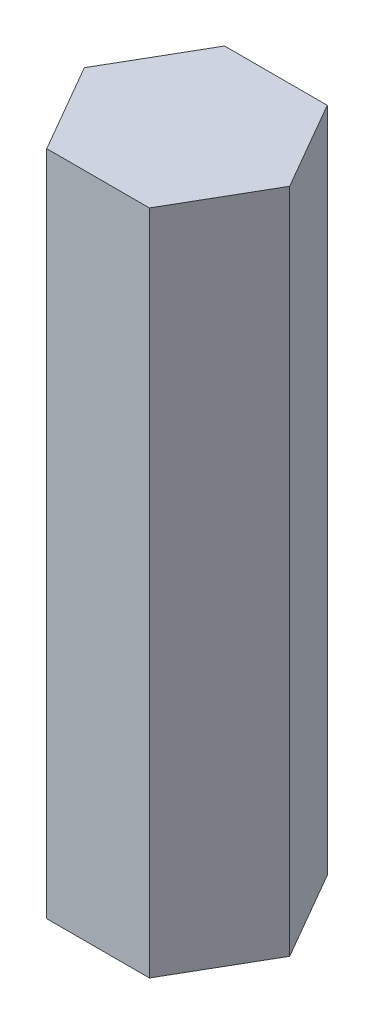
ISO-10303-21;
HEADER;
FILE_DESCRIPTION(('STEP AP214'),'2;1');
FILE_NAME('part.step','',(''),(''),'','','');
FILE_SCHEMA(('AUTOMOTIVE_DESIGN { 1 0 10303 214 1 1 1 1 }'));
ENDSEC;
DATA;
#1=APPLICATION_CONTEXT('core data for automotive mechanical design processes');
#2=APPLICATION_PROTOCOL_DEFINITION('international standard','automotive_design',2000,#1);
#3=PRODUCT_CONTEXT('',#1,'mechanical');
#4=PRODUCT('Part','Part','',(#3));
#5=PRODUCT_RELATED_PRODUCT_CATEGORY('part','',(#4));
#6=PRODUCT_DEFINITION_FORMATION('','',#4);
#7=PRODUCT_DEFINITION_CONTEXT('part definition',#1,'design');
#8=PRODUCT_DEFINITION('design','',#6,#7);
#9=PRODUCT_DEFINITION_SHAPE('','',#8);
#10=(LENGTH_UNIT() NAMED_UNIT(*) SI_UNIT(.MILLI.,.METRE.));
#11=(NAMED_UNIT(*) PLANE_ANGLE_UNIT() SI_UNIT($,.RADIAN.));
#12=(NAMED_UNIT(*) SI_UNIT($,.STERADIAN.) SOLID_ANGLE_UNIT());
#13=UNCERTAINTY_MEASURE_WITH_UNIT(LENGTH_MEASURE(1.E-05),#10,'distance_accuracy_value','');
#14=(GEOMETRIC_REPRESENTATION_CONTEXT(3) GLOBAL_UNCERTAINTY_ASSIGNED_CONTEXT((#13)) GLOBAL_UNIT_ASSIGNED_CONTEXT((#10,
#11,#12)) REPRESENTATION_CONTEXT('',''));
#15=CARTESIAN_POINT('',(0.,0.,0.));
#16=DIRECTION('',(0.,0.,1.));
#17=DIRECTION('',(1.,0.,0.));
#18=AXIS2_PLACEMENT_3D('',#15,#16,#17);
#19=CARTESIAN_POINT('',(2.30940107675852,30.,3.99999999999998));
#20=DIRECTION('',(-0.866025403784439,0.,-0.5));
#21=DIRECTION('',(-0.5,0.,0.866025403784439));
#22=AXIS2_PLACEMENT_3D('',#19,#20,#21);
#23=PLANE('',#22);
#24=DIRECTION('',(0.5,0.,-0.866025403784439));
#25=VECTOR('',#24,1.);
#26=CARTESIAN_POINT('',(2.30940107675852,0.,3.99999999999998));
#27=LINE('',#26,#25);
#28=CARTESIAN_POINT('',(2.30940107675852,0.,3.99999999999998));
#29=VERTEX_POINT('',#28);
#30=CARTESIAN_POINT('',(4.618802153517,0.,0.));
#31=VERTEX_POINT('',#30);
#32=EDGE_CURVE('E116',#29,#31,#27,.T.);
#33=ORIENTED_EDGE('',*,*,#32,.T.);
#34=DIRECTION('',(0.,-1.,0.));
#35=VECTOR('',#34,1.);
#36=CARTESIAN_POINT('',(4.618802153517,30.,0.));
#37=LINE('',#36,#35);
#38=CARTESIAN_POINT('',(4.618802153517,30.,0.));
#39=VERTEX_POINT('',#38);
#40=EDGE_CURVE('E11',#39,#31,#37,.T.);
#41=ORIENTED_EDGE('',*,*,#40,.F.);
#42=DIRECTION('',(0.5,0.,-0.866025403784439));
#43=VECTOR('',#42,1.);
#44=CARTESIAN_POINT('',(2.30940107675852,30.,3.99999999999998));
#45=LINE('',#44,#43);
#46=CARTESIAN_POINT('',(2.30940107675852,30.,3.99999999999998));
#47=VERTEX_POINT('',#46);
#48=EDGE_CURVE('E126',#47,#39,#45,.T.);
#49=ORIENTED_EDGE('',*,*,#48,.F.);
#50=DIRECTION('',(0.,-1.,0.));
#51=VECTOR('',#50,1.);
#52=CARTESIAN_POINT('',(2.30940107675852,30.,3.99999999999998));
#53=LINE('',#52,#51);
#54=EDGE_CURVE('E112',#47,#29,#53,.T.);
#55=ORIENTED_EDGE('',*,*,#54,.T.);
#56=EDGE_LOOP('',(#33,#41,#49,#55));
#57=FACE_BOUND('',#56,.T.);
#58=ADVANCED_FACE('F32',(#57),#23,.F.);
#59=CARTESIAN_POINT('',(4.618802153517,30.,0.));
#60=DIRECTION('',(-0.866025403784439,0.,0.499999999999999));
#61=DIRECTION('',(0.499999999999999,0.,0.866025403784439));
#62=AXIS2_PLACEMENT_3D('',#59,#60,#61);
#63=PLANE('',#62);
#64=DIRECTION('',(-0.499999999999999,0.,-0.866025403784439));
#65=VECTOR('',#64,1.);
#66=CARTESIAN_POINT('',(4.618802153517,0.,0.));
#67=LINE('',#66,#65);
#68=CARTESIAN_POINT('',(2.30940107675848,0.,-4.));
#69=VERTEX_POINT('',#68);
#70=EDGE_CURVE('E119',#31,#69,#67,.T.);
#71=ORIENTED_EDGE('',*,*,#70,.T.);
#72=DIRECTION('',(0.,-1.,0.));
#73=VECTOR('',#72,1.);
#74=CARTESIAN_POINT('',(2.30940107675848,30.,-4.));
#75=LINE('',#74,#73);
#76=CARTESIAN_POINT('',(2.30940107675848,30.,-4.));
#77=VERTEX_POINT('',#76);
#78=EDGE_CURVE('E40',#77,#69,#75,.T.);
#79=ORIENTED_EDGE('',*,*,#78,.F.);
#80=DIRECTION('',(-0.499999999999999,0.,-0.866025403784439));
#81=VECTOR('',#80,1.);
#82=CARTESIAN_POINT('',(4.618802153517,30.,0.));
#83=LINE('',#82,#81);
#84=EDGE_CURVE('E85',#39,#77,#83,.T.);
#85=ORIENTED_EDGE('',*,*,#84,.F.);
#86=ORIENTED_EDGE('',*,*,#40,.T.);
#87=EDGE_LOOP('',(#71,#79,#85,#86));
#88=FACE_BOUND('',#87,.T.);
#89=ADVANCED_FACE('F150',(#88),#63,.F.);
#90=CARTESIAN_POINT('',(2.30940107675848,30.,-4.));
#91=DIRECTION('',(0.,0.,1.));
#92=DIRECTION('',(1.,0.,0.));
#93=AXIS2_PLACEMENT_3D('',#90,#91,#92);
#94=PLANE('',#93);
#95=DIRECTION('',(-1.,0.,0.));
#96=VECTOR('',#95,1.);
#97=CARTESIAN_POINT('',(2.30940107675848,0.,-4.));
#98=LINE('',#97,#96);
#99=CARTESIAN_POINT('',(-2.3094010767585,0.,-4.));
#100=VERTEX_POINT('',#99);
#101=EDGE_CURVE('E121',#69,#100,#98,.T.);
#102=ORIENTED_EDGE('',*,*,#101,.T.);
#103=DIRECTION('',(0.,-1.,0.));
#104=VECTOR('',#103,1.);
#105=CARTESIAN_POINT('',(-2.3094010767585,30.,-4.));
#106=LINE('',#105,#104);
#107=CARTESIAN_POINT('',(-2.3094010767585,30.,-4.));
#108=VERTEX_POINT('',#107);
#109=EDGE_CURVE('E107',#108,#100,#106,.T.);
#110=ORIENTED_EDGE('',*,*,#109,.F.);
#111=DIRECTION('',(-1.,0.,0.));
#112=VECTOR('',#111,1.);
#113=CARTESIAN_POINT('',(2.30940107675848,30.,-4.));
#114=LINE('',#113,#112);
#115=EDGE_CURVE('E98',#77,#108,#114,.T.);
#116=ORIENTED_EDGE('',*,*,#115,.F.);
#117=ORIENTED_EDGE('',*,*,#78,.T.);
#118=EDGE_LOOP('',(#102,#110,#116,#117));
#119=FACE_BOUND('',#118,.T.);
#120=ADVANCED_FACE('F132',(#119),#94,.F.);
#121=CARTESIAN_POINT('',(-2.3094010767585,30.,-4.));
#122=DIRECTION('',(0.866025403784438,0.,0.500000000000001));
#123=DIRECTION('',(0.500000000000001,0.,-0.866025403784438));
#124=AXIS2_PLACEMENT_3D('',#121,#122,#123);
#125=PLANE('',#124);
#126=DIRECTION('',(-0.500000000000001,0.,0.866025403784438));
#127=VECTOR('',#126,1.);
#128=CARTESIAN_POINT('',(-2.3094010767585,0.,-4.));
#129=LINE('',#128,#127);
#130=CARTESIAN_POINT('',(-4.61880215351701,0.,0.));
#131=VERTEX_POINT('',#130);
#132=EDGE_CURVE('E106',#100,#131,#129,.T.);
#133=ORIENTED_EDGE('',*,*,#132,.T.);
#134=DIRECTION('',(0.,-1.,0.));
#135=VECTOR('',#134,1.);
#136=CARTESIAN_POINT('',(-4.61880215351701,30.,0.));
#137=LINE('',#136,#135);
#138=CARTESIAN_POINT('',(-4.61880215351701,30.,0.));
#139=VERTEX_POINT('',#138);
#140=EDGE_CURVE('E103',#139,#131,#137,.T.);
#141=ORIENTED_EDGE('',*,*,#140,.F.);
#142=DIRECTION('',(-0.500000000000001,0.,0.866025403784438));
#143=VECTOR('',#142,1.);
#144=CARTESIAN_POINT('',(-2.3094010767585,30.,-4.));
#145=LINE('',#144,#143);
#146=EDGE_CURVE('E92',#108,#139,#145,.T.);
#147=ORIENTED_EDGE('',*,*,#146,.F.);
#148=ORIENTED_EDGE('',*,*,#109,.T.);
#149=EDGE_LOOP('',(#133,#141,#147,#148));
#150=FACE_BOUND('',#149,.T.);
#151=ADVANCED_FACE('F104',(#150),#125,.F.);
#152=CARTESIAN_POINT('',(-4.61880215351701,30.,0.));
#153=DIRECTION('',(0.866025403784438,0.,-0.500000000000001));
#154=DIRECTION('',(-0.500000000000001,0.,-0.866025403784438));
#155=AXIS2_PLACEMENT_3D('',#152,#153,#154);
#156=PLANE('',#155);
#157=DIRECTION('',(0.500000000000001,0.,0.866025403784438));
#158=VECTOR('',#157,1.);
#159=CARTESIAN_POINT('',(-4.61880215351701,0.,0.));
#160=LINE('',#159,#158);
#161=CARTESIAN_POINT('',(-2.3094010767585,0.,3.99999999999999));
#162=VERTEX_POINT('',#161);
#163=EDGE_CURVE('E71',#131,#162,#160,.T.);
#164=ORIENTED_EDGE('',*,*,#163,.T.);
#165=DIRECTION('',(0.,-1.,0.));
#166=VECTOR('',#165,1.);
#167=CARTESIAN_POINT('',(-2.3094010767585,30.,3.99999999999999));
#168=LINE('',#167,#166);
#169=CARTESIAN_POINT('',(-2.3094010767585,30.,3.99999999999999));
#170=VERTEX_POINT('',#169);
#171=EDGE_CURVE('E108',#170,#162,#168,.T.);
#172=ORIENTED_EDGE('',*,*,#171,.F.);
#173=DIRECTION('',(0.500000000000001,0.,0.866025403784438));
#174=VECTOR('',#173,1.);
#175=CARTESIAN_POINT('',(-4.61880215351701,30.,0.));
#176=LINE('',#175,#174);
#177=EDGE_CURVE('E96',#139,#170,#176,.T.);
#178=ORIENTED_EDGE('',*,*,#177,.F.);
#179=ORIENTED_EDGE('',*,*,#140,.T.);
#180=EDGE_LOOP('',(#164,#172,#178,#179));
#181=FACE_BOUND('',#180,.T.);
#182=ADVANCED_FACE('F110',(#181),#156,.F.);
#183=CARTESIAN_POINT('',(-2.3094010767585,30.,3.99999999999999));
#184=DIRECTION('',(0.,0.,-1.));
#185=DIRECTION('',(-1.,0.,0.));
#186=AXIS2_PLACEMENT_3D('',#183,#184,#185);
#187=PLANE('',#186);
#188=DIRECTION('',(1.,0.,0.));
#189=VECTOR('',#188,1.);
#190=CARTESIAN_POINT('',(-2.3094010767585,0.,3.99999999999999));
#191=LINE('',#190,#189);
#192=EDGE_CURVE('E77',#162,#29,#191,.T.);
#193=ORIENTED_EDGE('',*,*,#192,.T.);
#194=ORIENTED_EDGE('',*,*,#54,.F.);
#195=DIRECTION('',(1.,0.,0.));
#196=VECTOR('',#195,1.);
#197=CARTESIAN_POINT('',(-2.3094010767585,30.,3.99999999999999));
#198=LINE('',#197,#196);
#199=EDGE_CURVE('E48',#170,#47,#198,.T.);
#200=ORIENTED_EDGE('',*,*,#199,.F.);
#201=ORIENTED_EDGE('',*,*,#171,.T.);
#202=EDGE_LOOP('',(#193,#194,#200,#201));
#203=FACE_BOUND('',#202,.T.);
#204=ADVANCED_FACE('F139',(#203),#187,.F.);
#205=CARTESIAN_POINT('',(0.,30.,0.));
#206=DIRECTION('',(0.,1.,0.));
#207=DIRECTION('',(0.,0.,1.));
#208=AXIS2_PLACEMENT_3D('',#205,#206,#207);
#209=PLANE('',#208);
#210=ORIENTED_EDGE('',*,*,#48,.T.);
#211=ORIENTED_EDGE('',*,*,#84,.T.);
#212=ORIENTED_EDGE('',*,*,#115,.T.);
#213=ORIENTED_EDGE('',*,*,#146,.T.);
#214=ORIENTED_EDGE('',*,*,#177,.T.);
#215=ORIENTED_EDGE('',*,*,#199,.T.);
#216=EDGE_LOOP('',(#210,#211,#212,#213,#214,#215));
#217=FACE_BOUND('',#216,.T.);
#218=ADVANCED_FACE('F94',(#217),#209,.T.);
#219=CARTESIAN_POINT('',(0.,0.,0.));
#220=DIRECTION('',(0.,1.,0.));
#221=DIRECTION('',(0.,0.,1.));
#222=AXIS2_PLACEMENT_3D('',#219,#220,#221);
#223=PLANE('',#222);
#224=ORIENTED_EDGE('',*,*,#32,.F.);
#225=ORIENTED_EDGE('',*,*,#192,.F.);
#226=ORIENTED_EDGE('',*,*,#163,.F.);
#227=ORIENTED_EDGE('',*,*,#132,.F.);
#228=ORIENTED_EDGE('',*,*,#101,.F.);
#229=ORIENTED_EDGE('',*,*,#70,.F.);
#230=EDGE_LOOP('',(#224,#225,#226,#227,#228,#229));
#231=FACE_BOUND('',#230,.T.);
#232=ADVANCED_FACE('F135',(#231),#223,.F.);
#233=CLOSED_SHELL('',(#58,#89,#120,#151,#182,#204,#218,#232));
#234=MANIFOLD_SOLID_BREP('B2',#233);
#235=ADVANCED_BREP_SHAPE_REPRESENTATION('',(#18,#234),#14);
#236=SHAPE_DEFINITION_REPRESENTATION(#9,#235);
ENDSEC;
END-ISO-10303-21;
